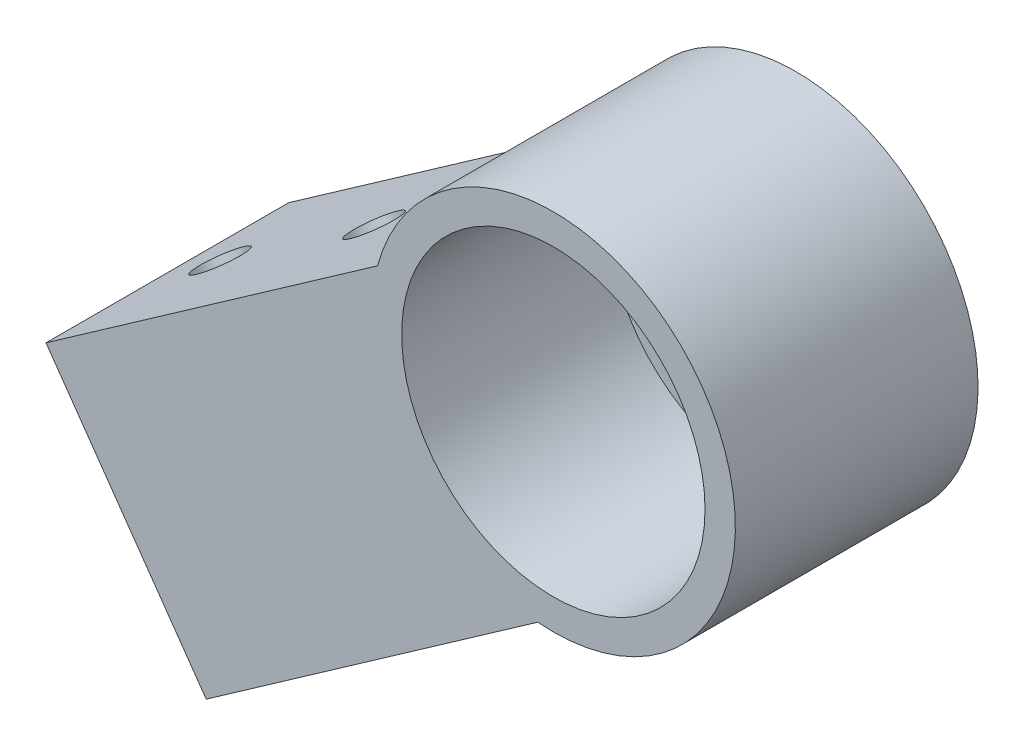
ISO-10303-21;
HEADER;
FILE_DESCRIPTION(('STEP AP214'),'2;1');
FILE_NAME('part.step','',(''),(''),'','','');
FILE_SCHEMA(('AUTOMOTIVE_DESIGN { 1 0 10303 214 1 1 1 1 }'));
ENDSEC;
DATA;
#1=APPLICATION_CONTEXT('core data for automotive mechanical design processes');
#2=APPLICATION_PROTOCOL_DEFINITION('international standard','automotive_design',2000,#1);
#3=PRODUCT_CONTEXT('',#1,'mechanical');
#4=PRODUCT('Part','Part','',(#3));
#5=PRODUCT_RELATED_PRODUCT_CATEGORY('part','',(#4));
#6=PRODUCT_DEFINITION_FORMATION('','',#4);
#7=PRODUCT_DEFINITION_CONTEXT('part definition',#1,'design');
#8=PRODUCT_DEFINITION('design','',#6,#7);
#9=PRODUCT_DEFINITION_SHAPE('','',#8);
#10=(LENGTH_UNIT() NAMED_UNIT(*) SI_UNIT(.MILLI.,.METRE.));
#11=(NAMED_UNIT(*) PLANE_ANGLE_UNIT() SI_UNIT($,.RADIAN.));
#12=(NAMED_UNIT(*) SI_UNIT($,.STERADIAN.) SOLID_ANGLE_UNIT());
#13=UNCERTAINTY_MEASURE_WITH_UNIT(LENGTH_MEASURE(1.E-05),#10,'distance_accuracy_value','');
#14=(GEOMETRIC_REPRESENTATION_CONTEXT(3) GLOBAL_UNCERTAINTY_ASSIGNED_CONTEXT((#13)) GLOBAL_UNIT_ASSIGNED_CONTEXT((#10,
#11,#12)) REPRESENTATION_CONTEXT('',''));
#15=CARTESIAN_POINT('',(0.,0.,0.));
#16=DIRECTION('',(0.,0.,1.));
#17=DIRECTION('',(1.,0.,0.));
#18=AXIS2_PLACEMENT_3D('',#15,#16,#17);
#19=CARTESIAN_POINT('',(0.,0.,3.));
#20=DIRECTION('',(0.,0.,-1.));
#21=DIRECTION('',(-1.,0.,0.));
#22=AXIS2_PLACEMENT_3D('',#19,#20,#21);
#23=CYLINDRICAL_SURFACE('',#22,15.);
#24=CARTESIAN_POINT('',(0.,0.,20.));
#25=DIRECTION('',(0.,0.,1.));
#26=DIRECTION('',(1.,0.,0.));
#27=AXIS2_PLACEMENT_3D('',#24,#25,#26);
#28=CIRCLE('',#27,15.);
#29=CARTESIAN_POINT('',(-1.28498679073982,-14.9448589470635,20.));
#30=VERTEX_POINT('',#29);
#31=CARTESIAN_POINT('',(-14.4871716284404,3.88868335148424,20.));
#32=VERTEX_POINT('',#31);
#33=EDGE_CURVE('E221',#30,#32,#28,.T.);
#34=ORIENTED_EDGE('',*,*,#33,.F.);
#35=DIRECTION('',(0.,0.,-1.));
#36=VECTOR('',#35,1.);
#37=CARTESIAN_POINT('',(-1.28498679073983,-14.9448589470635,75.5471115656489));
#38=LINE('',#37,#36);
#39=CARTESIAN_POINT('',(-1.28498679073983,-14.9448589470635,0.));
#40=VERTEX_POINT('',#39);
#41=EDGE_CURVE('E64',#30,#40,#38,.T.);
#42=ORIENTED_EDGE('',*,*,#41,.T.);
#43=CARTESIAN_POINT('',(0.,0.,0.));
#44=DIRECTION('',(0.,0.,1.));
#45=DIRECTION('',(1.,0.,0.));
#46=AXIS2_PLACEMENT_3D('',#43,#44,#45);
#47=CIRCLE('',#46,15.);
#48=CARTESIAN_POINT('',(-14.4871716284404,3.88868335148424,0.));
#49=VERTEX_POINT('',#48);
#50=EDGE_CURVE('E48',#40,#49,#47,.T.);
#51=ORIENTED_EDGE('',*,*,#50,.T.);
#52=DIRECTION('',(0.,0.,-1.));
#53=VECTOR('',#52,1.);
#54=CARTESIAN_POINT('',(-14.4871716284404,3.88868335148424,75.5471115656489));
#55=LINE('',#54,#53);
#56=EDGE_CURVE('E179',#32,#49,#55,.T.);
#57=ORIENTED_EDGE('',*,*,#56,.F.);
#58=EDGE_LOOP('',(#34,#42,#51,#57));
#59=FACE_BOUND('',#58,.T.);
#60=ADVANCED_FACE('F39',(#59),#23,.T.);
#61=CARTESIAN_POINT('',(0.,0.,0.));
#62=DIRECTION('',(0.,0.,1.));
#63=DIRECTION('',(1.,0.,0.));
#64=AXIS2_PLACEMENT_3D('',#61,#62,#63);
#65=PLANE('',#64);
#66=CARTESIAN_POINT('',(6.96022215381102,4.87906830958517,0.));
#67=DIRECTION('',(0.,0.,1.));
#68=DIRECTION('',(1.,0.,0.));
#69=AXIS2_PLACEMENT_3D('',#66,#67,#68);
#70=CIRCLE('',#69,1.5);
#71=CARTESIAN_POINT('',(8.46022215381102,4.87906830958517,0.));
#72=VERTEX_POINT('',#71);
#73=EDGE_CURVE('E199',#72,#72,#70,.F.);
#74=ORIENTED_EDGE('',*,*,#73,.F.);
#75=EDGE_LOOP('',(#74));
#76=FACE_BOUND('',#75,.T.);
#77=CARTESIAN_POINT('',(-6.96022215381102,-4.87906830958517,0.));
#78=DIRECTION('',(0.,0.,1.));
#79=DIRECTION('',(1.,0.,0.));
#80=AXIS2_PLACEMENT_3D('',#77,#78,#79);
#81=CIRCLE('',#80,1.5);
#82=CARTESIAN_POINT('',(-5.46022215381102,-4.87906830958517,0.));
#83=VERTEX_POINT('',#82);
#84=EDGE_CURVE('E198',#83,#83,#81,.F.);
#85=ORIENTED_EDGE('',*,*,#84,.F.);
#86=EDGE_LOOP('',(#85));
#87=FACE_BOUND('',#86,.T.);
#88=CARTESIAN_POINT('',(0.,0.,0.));
#89=DIRECTION('',(0.,0.,1.));
#90=DIRECTION('',(1.,0.,0.));
#91=AXIS2_PLACEMENT_3D('',#88,#89,#90);
#92=CIRCLE('',#91,3.);
#93=CARTESIAN_POINT('',(3.,0.,0.));
#94=VERTEX_POINT('',#93);
#95=EDGE_CURVE('E213',#94,#94,#92,.F.);
#96=ORIENTED_EDGE('',*,*,#95,.F.);
#97=EDGE_LOOP('',(#96));
#98=FACE_BOUND('',#97,.T.);
#99=ORIENTED_EDGE('',*,*,#50,.F.);
#100=DIRECTION('',(-0.81884966515425,-0.574008036421767,0.));
#101=VECTOR('',#100,1.);
#102=CARTESIAN_POINT('',(-28.6094431827825,-34.0991167154098,0.));
#103=LINE('',#102,#101);
#104=CARTESIAN_POINT('',(-28.6094431827825,-34.0991167154098,0.));
#105=VERTEX_POINT('',#104);
#106=EDGE_CURVE('E155',#40,#105,#103,.T.);
#107=ORIENTED_EDGE('',*,*,#106,.T.);
#108=DIRECTION('',(-0.574008036421766,0.81884966515425,0.));
#109=VECTOR('',#108,1.);
#110=CARTESIAN_POINT('',(-41.8116280204831,-15.2655744168621,0.));
#111=LINE('',#110,#109);
#112=CARTESIAN_POINT('',(-41.8116280204831,-15.2655744168621,0.));
#113=VERTEX_POINT('',#112);
#114=EDGE_CURVE('E166',#105,#113,#111,.T.);
#115=ORIENTED_EDGE('',*,*,#114,.T.);
#116=DIRECTION('',(0.81884966515425,0.574008036421766,0.));
#117=VECTOR('',#116,1.);
#118=CARTESIAN_POINT('',(-14.4871716284404,3.88868335148424,0.));
#119=LINE('',#118,#117);
#120=EDGE_CURVE('E161',#113,#49,#119,.T.);
#121=ORIENTED_EDGE('',*,*,#120,.T.);
#122=EDGE_LOOP('',(#99,#107,#115,#121));
#123=FACE_BOUND('',#122,.T.);
#124=ADVANCED_FACE('F279',(#76,#87,#98,#123),#65,.F.);
#125=CARTESIAN_POINT('',(0.,0.,20.));
#126=DIRECTION('',(0.,0.,1.));
#127=DIRECTION('',(1.,0.,0.));
#128=AXIS2_PLACEMENT_3D('',#125,#126,#127);
#129=PLANE('',#128);
#130=ORIENTED_EDGE('',*,*,#33,.T.);
#131=DIRECTION('',(0.818849665154251,0.574008036421766,0.));
#132=VECTOR('',#131,1.);
#133=CARTESIAN_POINT('',(-14.4871716284404,3.88868335148424,20.));
#134=LINE('',#133,#132);
#135=CARTESIAN_POINT('',(-41.8116280204831,-15.2655744168621,20.));
#136=VERTEX_POINT('',#135);
#137=EDGE_CURVE('E176',#136,#32,#134,.T.);
#138=ORIENTED_EDGE('',*,*,#137,.F.);
#139=DIRECTION('',(-0.574008036421766,0.818849665154251,0.));
#140=VECTOR('',#139,1.);
#141=CARTESIAN_POINT('',(-41.8116280204831,-15.2655744168621,20.));
#142=LINE('',#141,#140);
#143=CARTESIAN_POINT('',(-28.6094431827825,-34.0991167154098,20.));
#144=VERTEX_POINT('',#143);
#145=EDGE_CURVE('E181',#144,#136,#142,.T.);
#146=ORIENTED_EDGE('',*,*,#145,.F.);
#147=DIRECTION('',(-0.81884966515425,-0.574008036421767,0.));
#148=VECTOR('',#147,1.);
#149=CARTESIAN_POINT('',(-28.6094431827825,-34.0991167154098,20.));
#150=LINE('',#149,#148);
#151=EDGE_CURVE('E165',#30,#144,#150,.T.);
#152=ORIENTED_EDGE('',*,*,#151,.F.);
#153=EDGE_LOOP('',(#130,#138,#146,#152));
#154=FACE_BOUND('',#153,.T.);
#155=CARTESIAN_POINT('',(0.,0.,20.));
#156=DIRECTION('',(0.,0.,1.));
#157=DIRECTION('',(1.,0.,0.));
#158=AXIS2_PLACEMENT_3D('',#155,#156,#157);
#159=CIRCLE('',#158,12.5);
#160=CARTESIAN_POINT('',(12.5,0.,20.));
#161=VERTEX_POINT('',#160);
#162=EDGE_CURVE('E217',#161,#161,#159,.T.);
#163=ORIENTED_EDGE('',*,*,#162,.F.);
#164=EDGE_LOOP('',(#163));
#165=FACE_BOUND('',#164,.T.);
#166=ADVANCED_FACE('F284',(#154,#165),#129,.T.);
#167=CARTESIAN_POINT('',(0.,0.,20.));
#168=DIRECTION('',(0.,0.,-1.));
#169=DIRECTION('',(-1.,0.,0.));
#170=AXIS2_PLACEMENT_3D('',#167,#168,#169);
#171=CYLINDRICAL_SURFACE('',#170,12.5);
#172=ORIENTED_EDGE('',*,*,#162,.T.);
#173=EDGE_LOOP('',(#172));
#174=FACE_BOUND('',#173,.T.);
#175=CARTESIAN_POINT('',(0.,0.,3.));
#176=DIRECTION('',(0.,0.,1.));
#177=DIRECTION('',(1.,0.,0.));
#178=AXIS2_PLACEMENT_3D('',#175,#176,#177);
#179=CIRCLE('',#178,12.5);
#180=CARTESIAN_POINT('',(12.5,0.,3.));
#181=VERTEX_POINT('',#180);
#182=EDGE_CURVE('E11',#181,#181,#179,.F.);
#183=ORIENTED_EDGE('',*,*,#182,.T.);
#184=EDGE_LOOP('',(#183));
#185=FACE_BOUND('',#184,.T.);
#186=ADVANCED_FACE('F332',(#174,#185),#171,.F.);
#187=CARTESIAN_POINT('',(0.,0.,3.));
#188=DIRECTION('',(0.,0.,1.));
#189=DIRECTION('',(1.,0.,0.));
#190=AXIS2_PLACEMENT_3D('',#187,#188,#189);
#191=PLANE('',#190);
#192=CARTESIAN_POINT('',(0.,0.,3.));
#193=DIRECTION('',(0.,0.,1.));
#194=DIRECTION('',(1.,0.,0.));
#195=AXIS2_PLACEMENT_3D('',#192,#193,#194);
#196=CIRCLE('',#195,3.);
#197=CARTESIAN_POINT('',(3.,0.,3.));
#198=VERTEX_POINT('',#197);
#199=EDGE_CURVE('E203',#198,#198,#196,.T.);
#200=ORIENTED_EDGE('',*,*,#199,.F.);
#201=EDGE_LOOP('',(#200));
#202=FACE_BOUND('',#201,.T.);
#203=CARTESIAN_POINT('',(6.96022215381102,4.87906830958517,3.));
#204=DIRECTION('',(0.,0.,1.));
#205=DIRECTION('',(1.,0.,0.));
#206=AXIS2_PLACEMENT_3D('',#203,#204,#205);
#207=CIRCLE('',#206,1.5);
#208=CARTESIAN_POINT('',(8.46022215381102,4.87906830958517,3.));
#209=VERTEX_POINT('',#208);
#210=EDGE_CURVE('E193',#209,#209,#207,.T.);
#211=ORIENTED_EDGE('',*,*,#210,.F.);
#212=EDGE_LOOP('',(#211));
#213=FACE_BOUND('',#212,.T.);
#214=CARTESIAN_POINT('',(-6.96022215381102,-4.87906830958517,3.));
#215=DIRECTION('',(0.,0.,1.));
#216=DIRECTION('',(1.,0.,0.));
#217=AXIS2_PLACEMENT_3D('',#214,#215,#216);
#218=CIRCLE('',#217,1.5);
#219=CARTESIAN_POINT('',(-5.46022215381102,-4.87906830958517,3.));
#220=VERTEX_POINT('',#219);
#221=EDGE_CURVE('E194',#220,#220,#218,.T.);
#222=ORIENTED_EDGE('',*,*,#221,.F.);
#223=EDGE_LOOP('',(#222));
#224=FACE_BOUND('',#223,.T.);
#225=ORIENTED_EDGE('',*,*,#182,.F.);
#226=EDGE_LOOP('',(#225));
#227=FACE_BOUND('',#226,.T.);
#228=ADVANCED_FACE('F324',(#202,#213,#224,#227),#191,.T.);
#229=CARTESIAN_POINT('',(-6.96022215381102,-4.87906830958517,-8.48528137423857));
#230=DIRECTION('',(0.,0.,1.));
#231=DIRECTION('',(1.,0.,0.));
#232=AXIS2_PLACEMENT_3D('',#229,#230,#231);
#233=CYLINDRICAL_SURFACE('',#232,1.5);
#234=ORIENTED_EDGE('',*,*,#84,.T.);
#235=EDGE_LOOP('',(#234));
#236=FACE_BOUND('',#235,.T.);
#237=ORIENTED_EDGE('',*,*,#221,.T.);
#238=EDGE_LOOP('',(#237));
#239=FACE_BOUND('',#238,.T.);
#240=ADVANCED_FACE('F320',(#236,#239),#233,.F.);
#241=CARTESIAN_POINT('',(6.96022215381102,4.87906830958517,-8.48528137423857));
#242=DIRECTION('',(0.,0.,1.));
#243=DIRECTION('',(1.,0.,0.));
#244=AXIS2_PLACEMENT_3D('',#241,#242,#243);
#245=CYLINDRICAL_SURFACE('',#244,1.5);
#246=ORIENTED_EDGE('',*,*,#73,.T.);
#247=EDGE_LOOP('',(#246));
#248=FACE_BOUND('',#247,.T.);
#249=ORIENTED_EDGE('',*,*,#210,.T.);
#250=EDGE_LOOP('',(#249));
#251=FACE_BOUND('',#250,.T.);
#252=ADVANCED_FACE('F323',(#248,#251),#245,.F.);
#253=CARTESIAN_POINT('',(0.,0.,-8.48528137423857));
#254=DIRECTION('',(0.,0.,1.));
#255=DIRECTION('',(1.,0.,0.));
#256=AXIS2_PLACEMENT_3D('',#253,#254,#255);
#257=CYLINDRICAL_SURFACE('',#256,3.);
#258=ORIENTED_EDGE('',*,*,#95,.T.);
#259=EDGE_LOOP('',(#258));
#260=FACE_BOUND('',#259,.T.);
#261=ORIENTED_EDGE('',*,*,#199,.T.);
#262=EDGE_LOOP('',(#261));
#263=FACE_BOUND('',#262,.T.);
#264=ADVANCED_FACE('F318',(#260,#263),#257,.F.);
#265=CARTESIAN_POINT('',(-28.6094431827825,-34.0991167154098,75.5471115656489));
#266=DIRECTION('',(0.574008036421767,-0.81884966515425,0.));
#267=DIRECTION('',(0.81884966515425,0.574008036421767,0.));
#268=AXIS2_PLACEMENT_3D('',#265,#266,#267);
#269=PLANE('',#268);
#270=CARTESIAN_POINT('',(-11.5773701475741,-22.1597495578372,10.));
#271=DIRECTION('',(0.574008036421767,-0.81884966515425,0.));
#272=DIRECTION('',(0.81884966515425,0.574008036421767,0.));
#273=AXIS2_PLACEMENT_3D('',#270,#271,#272);
#274=CIRCLE('',#273,2.);
#275=CARTESIAN_POINT('',(-9.93967081726564,-21.0117334849936,10.));
#276=VERTEX_POINT('',#275);
#277=EDGE_CURVE('E240',#276,#276,#274,.T.);
#278=ORIENTED_EDGE('',*,*,#277,.F.);
#279=EDGE_LOOP('',(#278));
#280=FACE_BOUND('',#279,.T.);
#281=CARTESIAN_POINT('',(-24.269539957465,-31.0568741223745,10.));
#282=DIRECTION('',(0.574008036421767,-0.81884966515425,0.));
#283=DIRECTION('',(0.81884966515425,0.574008036421767,0.));
#284=AXIS2_PLACEMENT_3D('',#281,#282,#283);
#285=CIRCLE('',#284,2.);
#286=CARTESIAN_POINT('',(-22.6318406271565,-29.908858049531,10.));
#287=VERTEX_POINT('',#286);
#288=EDGE_CURVE('E231',#287,#287,#285,.T.);
#289=ORIENTED_EDGE('',*,*,#288,.F.);
#290=EDGE_LOOP('',(#289));
#291=FACE_BOUND('',#290,.T.);
#292=ORIENTED_EDGE('',*,*,#41,.F.);
#293=ORIENTED_EDGE('',*,*,#151,.T.);
#294=DIRECTION('',(0.,0.,-1.));
#295=VECTOR('',#294,1.);
#296=CARTESIAN_POINT('',(-28.6094431827825,-34.0991167154098,75.5471115656489));
#297=LINE('',#296,#295);
#298=EDGE_CURVE('E175',#144,#105,#297,.T.);
#299=ORIENTED_EDGE('',*,*,#298,.T.);
#300=ORIENTED_EDGE('',*,*,#106,.F.);
#301=EDGE_LOOP('',(#292,#293,#299,#300));
#302=FACE_BOUND('',#301,.T.);
#303=ADVANCED_FACE('F293',(#280,#291,#302),#269,.T.);
#304=CARTESIAN_POINT('',(-41.8116280204831,-15.2655744168621,75.5471115656489));
#305=DIRECTION('',(-0.818849665154251,-0.574008036421766,0.));
#306=DIRECTION('',(0.574008036421766,-0.818849665154251,0.));
#307=AXIS2_PLACEMENT_3D('',#304,#305,#306);
#308=PLANE('',#307);
#309=DIRECTION('',(0.,0.,-1.));
#310=VECTOR('',#309,1.);
#311=CARTESIAN_POINT('',(-38.9415878383743,-19.3598227426333,3.5));
#312=LINE('',#311,#310);
#313=CARTESIAN_POINT('',(-38.9415878383743,-19.3598227426333,16.5));
#314=VERTEX_POINT('',#313);
#315=CARTESIAN_POINT('',(-38.9415878383743,-19.3598227426333,3.5));
#316=VERTEX_POINT('',#315);
#317=EDGE_CURVE('E56',#314,#316,#312,.T.);
#318=ORIENTED_EDGE('',*,*,#317,.F.);
#319=DIRECTION('',(-0.574008036421767,0.81884966515425,0.));
#320=VECTOR('',#319,1.);
#321=CARTESIAN_POINT('',(-31.4794833648913,-30.0048683896386,16.5));
#322=LINE('',#321,#320);
#323=CARTESIAN_POINT('',(-31.4794833648913,-30.0048683896386,16.5));
#324=VERTEX_POINT('',#323);
#325=EDGE_CURVE('E130',#324,#314,#322,.T.);
#326=ORIENTED_EDGE('',*,*,#325,.F.);
#327=DIRECTION('',(0.,0.,1.));
#328=VECTOR('',#327,1.);
#329=CARTESIAN_POINT('',(-31.4794833648913,-30.0048683896386,3.5));
#330=LINE('',#329,#328);
#331=CARTESIAN_POINT('',(-31.4794833648913,-30.0048683896386,3.5));
#332=VERTEX_POINT('',#331);
#333=EDGE_CURVE('E134',#332,#324,#330,.T.);
#334=ORIENTED_EDGE('',*,*,#333,.F.);
#335=DIRECTION('',(0.574008036421766,-0.818849665154251,0.));
#336=VECTOR('',#335,1.);
#337=CARTESIAN_POINT('',(-31.4794833648913,-30.0048683896386,3.5));
#338=LINE('',#337,#336);
#339=EDGE_CURVE('E146',#316,#332,#338,.T.);
#340=ORIENTED_EDGE('',*,*,#339,.F.);
#341=EDGE_LOOP('',(#318,#326,#334,#340));
#342=FACE_BOUND('',#341,.T.);
#343=ORIENTED_EDGE('',*,*,#298,.F.);
#344=ORIENTED_EDGE('',*,*,#145,.T.);
#345=DIRECTION('',(0.,0.,-1.));
#346=VECTOR('',#345,1.);
#347=CARTESIAN_POINT('',(-41.8116280204831,-15.2655744168621,75.5471115656489));
#348=LINE('',#347,#346);
#349=EDGE_CURVE('E180',#136,#113,#348,.T.);
#350=ORIENTED_EDGE('',*,*,#349,.T.);
#351=ORIENTED_EDGE('',*,*,#114,.F.);
#352=EDGE_LOOP('',(#343,#344,#350,#351));
#353=FACE_BOUND('',#352,.T.);
#354=ADVANCED_FACE('F296',(#342,#353),#308,.T.);
#355=CARTESIAN_POINT('',(-14.4871716284404,3.88868335148424,75.5471115656489));
#356=DIRECTION('',(-0.574008036421766,0.818849665154251,0.));
#357=DIRECTION('',(-0.818849665154251,-0.574008036421766,0.));
#358=AXIS2_PLACEMENT_3D('',#355,#356,#357);
#359=PLANE('',#358);
#360=CARTESIAN_POINT('',(-24.7795549852748,-3.32620725928941,10.));
#361=DIRECTION('',(-0.574008036421766,0.818849665154251,0.));
#362=DIRECTION('',(-0.818849665154251,-0.574008036421766,0.));
#363=AXIS2_PLACEMENT_3D('',#360,#361,#362);
#364=CIRCLE('',#363,2.);
#365=CARTESIAN_POINT('',(-26.4172543155833,-4.47422333213294,10.));
#366=VERTEX_POINT('',#365);
#367=EDGE_CURVE('E137',#366,#366,#364,.T.);
#368=ORIENTED_EDGE('',*,*,#367,.F.);
#369=EDGE_LOOP('',(#368));
#370=FACE_BOUND('',#369,.T.);
#371=CARTESIAN_POINT('',(-37.4717247951657,-12.2233318238268,10.));
#372=DIRECTION('',(-0.574008036421766,0.818849665154251,0.));
#373=DIRECTION('',(-0.818849665154251,-0.574008036421766,0.));
#374=AXIS2_PLACEMENT_3D('',#371,#372,#373);
#375=CIRCLE('',#374,2.);
#376=CARTESIAN_POINT('',(-39.1094241254742,-13.3713478966703,10.));
#377=VERTEX_POINT('',#376);
#378=EDGE_CURVE('E237',#377,#377,#375,.T.);
#379=ORIENTED_EDGE('',*,*,#378,.F.);
#380=EDGE_LOOP('',(#379));
#381=FACE_BOUND('',#380,.T.);
#382=ORIENTED_EDGE('',*,*,#349,.F.);
#383=ORIENTED_EDGE('',*,*,#137,.T.);
#384=ORIENTED_EDGE('',*,*,#56,.T.);
#385=ORIENTED_EDGE('',*,*,#120,.F.);
#386=EDGE_LOOP('',(#382,#383,#384,#385));
#387=FACE_BOUND('',#386,.T.);
#388=ADVANCED_FACE('F300',(#370,#381,#387),#359,.T.);
#389=CARTESIAN_POINT('',(-17.6514965443637,-4.43561379566742,3.5));
#390=DIRECTION('',(-0.574008036421766,0.81884966515425,0.));
#391=DIRECTION('',(-0.81884966515425,-0.574008036421766,0.));
#392=AXIS2_PLACEMENT_3D('',#389,#390,#391);
#393=PLANE('',#392);
#394=CARTESIAN_POINT('',(-21.9095148031659,-7.42045558506067,10.));
#395=DIRECTION('',(-0.574008036421766,0.81884966515425,0.));
#396=DIRECTION('',(-0.81884966515425,-0.574008036421766,0.));
#397=AXIS2_PLACEMENT_3D('',#394,#395,#396);
#398=CIRCLE('',#397,2.);
#399=CARTESIAN_POINT('',(-23.5472141334744,-8.5684716579042,10.));
#400=VERTEX_POINT('',#399);
#401=EDGE_CURVE('E250',#400,#400,#398,.T.);
#402=ORIENTED_EDGE('',*,*,#401,.T.);
#403=EDGE_LOOP('',(#402));
#404=FACE_BOUND('',#403,.T.);
#405=CARTESIAN_POINT('',(-34.6016846130568,-16.317580149598,10.));
#406=DIRECTION('',(-0.574008036421766,0.81884966515425,0.));
#407=DIRECTION('',(-0.81884966515425,-0.574008036421766,0.));
#408=AXIS2_PLACEMENT_3D('',#405,#406,#407);
#409=CIRCLE('',#408,2.);
#410=CARTESIAN_POINT('',(-36.2393839433653,-17.4655962224416,10.));
#411=VERTEX_POINT('',#410);
#412=EDGE_CURVE('E230',#411,#411,#409,.T.);
#413=ORIENTED_EDGE('',*,*,#412,.T.);
#414=EDGE_LOOP('',(#413));
#415=FACE_BOUND('',#414,.T.);
#416=ORIENTED_EDGE('',*,*,#317,.T.);
#417=DIRECTION('',(-0.81884966515425,-0.574008036421766,0.));
#418=VECTOR('',#417,1.);
#419=CARTESIAN_POINT('',(-17.6514965443637,-4.43561379566742,3.5));
#420=LINE('',#419,#418);
#421=CARTESIAN_POINT('',(-17.6514965443637,-4.43561379566742,3.5));
#422=VERTEX_POINT('',#421);
#423=EDGE_CURVE('E105',#422,#316,#420,.T.);
#424=ORIENTED_EDGE('',*,*,#423,.F.);
#425=DIRECTION('',(0.,0.,-1.));
#426=VECTOR('',#425,1.);
#427=CARTESIAN_POINT('',(-17.6514965443637,-4.43561379566742,3.5));
#428=LINE('',#427,#426);
#429=CARTESIAN_POINT('',(-17.6514965443638,-4.43561379566742,16.5));
#430=VERTEX_POINT('',#429);
#431=EDGE_CURVE('E109',#430,#422,#428,.T.);
#432=ORIENTED_EDGE('',*,*,#431,.F.);
#433=DIRECTION('',(-0.81884966515425,-0.574008036421766,0.));
#434=VECTOR('',#433,1.);
#435=CARTESIAN_POINT('',(-17.6514965443638,-4.43561379566742,16.5));
#436=LINE('',#435,#434);
#437=EDGE_CURVE('E152',#430,#314,#436,.T.);
#438=ORIENTED_EDGE('',*,*,#437,.T.);
#439=EDGE_LOOP('',(#416,#424,#432,#438));
#440=FACE_BOUND('',#439,.T.);
#441=ADVANCED_FACE('F107',(#404,#415,#440),#393,.F.);
#442=CARTESIAN_POINT('',(-10.1893920708808,-15.0806594426727,16.5));
#443=DIRECTION('',(0.,0.,1.));
#444=DIRECTION('',(1.,0.,0.));
#445=AXIS2_PLACEMENT_3D('',#442,#443,#444);
#446=PLANE('',#445);
#447=ORIENTED_EDGE('',*,*,#325,.T.);
#448=ORIENTED_EDGE('',*,*,#437,.F.);
#449=DIRECTION('',(-0.574008036421767,0.81884966515425,0.));
#450=VECTOR('',#449,1.);
#451=CARTESIAN_POINT('',(-10.1893920708808,-15.0806594426727,16.5));
#452=LINE('',#451,#450);
#453=CARTESIAN_POINT('',(-10.1893920708808,-15.0806594426727,16.5));
#454=VERTEX_POINT('',#453);
#455=EDGE_CURVE('E116',#454,#430,#452,.T.);
#456=ORIENTED_EDGE('',*,*,#455,.F.);
#457=DIRECTION('',(-0.81884966515425,-0.574008036421766,0.));
#458=VECTOR('',#457,1.);
#459=CARTESIAN_POINT('',(-10.1893920708808,-15.0806594426727,16.5));
#460=LINE('',#459,#458);
#461=EDGE_CURVE('E156',#454,#324,#460,.T.);
#462=ORIENTED_EDGE('',*,*,#461,.T.);
#463=EDGE_LOOP('',(#447,#448,#456,#462));
#464=FACE_BOUND('',#463,.T.);
#465=ADVANCED_FACE('F308',(#464),#446,.F.);
#466=CARTESIAN_POINT('',(-10.1893920708808,-15.0806594426727,3.5));
#467=DIRECTION('',(0.574008036421766,-0.81884966515425,0.));
#468=DIRECTION('',(0.81884966515425,0.574008036421766,0.));
#469=AXIS2_PLACEMENT_3D('',#466,#467,#468);
#470=PLANE('',#469);
#471=CARTESIAN_POINT('',(-14.447410329683,-18.0655012320659,10.));
#472=DIRECTION('',(0.574008036421766,-0.81884966515425,0.));
#473=DIRECTION('',(0.81884966515425,0.574008036421766,0.));
#474=AXIS2_PLACEMENT_3D('',#471,#472,#473);
#475=CIRCLE('',#474,2.);
#476=CARTESIAN_POINT('',(-12.8097109993745,-16.9174851592224,10.));
#477=VERTEX_POINT('',#476);
#478=EDGE_CURVE('E42',#477,#477,#475,.T.);
#479=ORIENTED_EDGE('',*,*,#478,.T.);
#480=EDGE_LOOP('',(#479));
#481=FACE_BOUND('',#480,.T.);
#482=CARTESIAN_POINT('',(-27.1395801395739,-26.9626257966033,10.));
#483=DIRECTION('',(0.574008036421766,-0.81884966515425,0.));
#484=DIRECTION('',(0.81884966515425,0.574008036421766,0.));
#485=AXIS2_PLACEMENT_3D('',#482,#483,#484);
#486=CIRCLE('',#485,2.);
#487=CARTESIAN_POINT('',(-25.5018808092654,-25.8146097237598,10.));
#488=VERTEX_POINT('',#487);
#489=EDGE_CURVE('E227',#488,#488,#486,.T.);
#490=ORIENTED_EDGE('',*,*,#489,.T.);
#491=EDGE_LOOP('',(#490));
#492=FACE_BOUND('',#491,.T.);
#493=ORIENTED_EDGE('',*,*,#333,.T.);
#494=ORIENTED_EDGE('',*,*,#461,.F.);
#495=DIRECTION('',(0.,0.,1.));
#496=VECTOR('',#495,1.);
#497=CARTESIAN_POINT('',(-10.1893920708808,-15.0806594426727,3.5));
#498=LINE('',#497,#496);
#499=CARTESIAN_POINT('',(-10.1893920708808,-15.0806594426727,3.5));
#500=VERTEX_POINT('',#499);
#501=EDGE_CURVE('E125',#500,#454,#498,.T.);
#502=ORIENTED_EDGE('',*,*,#501,.F.);
#503=DIRECTION('',(-0.81884966515425,-0.574008036421766,0.));
#504=VECTOR('',#503,1.);
#505=CARTESIAN_POINT('',(-10.1893920708808,-15.0806594426727,3.5));
#506=LINE('',#505,#504);
#507=EDGE_CURVE('E115',#500,#332,#506,.T.);
#508=ORIENTED_EDGE('',*,*,#507,.T.);
#509=EDGE_LOOP('',(#493,#494,#502,#508));
#510=FACE_BOUND('',#509,.T.);
#511=ADVANCED_FACE('F261',(#481,#492,#510),#470,.F.);
#512=CARTESIAN_POINT('',(-10.1893920708808,-15.0806594426727,3.5));
#513=DIRECTION('',(0.,0.,-1.));
#514=DIRECTION('',(-1.,0.,0.));
#515=AXIS2_PLACEMENT_3D('',#512,#513,#514);
#516=PLANE('',#515);
#517=ORIENTED_EDGE('',*,*,#339,.T.);
#518=ORIENTED_EDGE('',*,*,#507,.F.);
#519=DIRECTION('',(0.574008036421766,-0.818849665154251,0.));
#520=VECTOR('',#519,1.);
#521=CARTESIAN_POINT('',(-10.1893920708808,-15.0806594426727,3.5));
#522=LINE('',#521,#520);
#523=EDGE_CURVE('E119',#422,#500,#522,.T.);
#524=ORIENTED_EDGE('',*,*,#523,.F.);
#525=ORIENTED_EDGE('',*,*,#423,.T.);
#526=EDGE_LOOP('',(#517,#518,#524,#525));
#527=FACE_BOUND('',#526,.T.);
#528=ADVANCED_FACE('F120',(#527),#516,.F.);
#529=CARTESIAN_POINT('',(-13.9204443076223,-9.75813661917005,0.));
#530=DIRECTION('',(-0.81884966515425,-0.574008036421767,0.));
#531=DIRECTION('',(0.574008036421767,-0.81884966515425,0.));
#532=AXIS2_PLACEMENT_3D('',#529,#530,#531);
#533=PLANE('',#532);
#534=ORIENTED_EDGE('',*,*,#431,.T.);
#535=ORIENTED_EDGE('',*,*,#523,.T.);
#536=ORIENTED_EDGE('',*,*,#501,.T.);
#537=ORIENTED_EDGE('',*,*,#455,.T.);
#538=EDGE_LOOP('',(#534,#535,#536,#537));
#539=FACE_BOUND('',#538,.T.);
#540=ADVANCED_FACE('F127',(#539),#533,.T.);
#541=CARTESIAN_POINT('',(-51.697340405217,8.07018297000525,10.));
#542=DIRECTION('',(0.574008036421767,-0.81884966515425,0.));
#543=DIRECTION('',(0.81884966515425,0.574008036421767,0.));
#544=AXIS2_PLACEMENT_3D('',#541,#542,#543);
#545=CYLINDRICAL_SURFACE('',#544,2.);
#546=ORIENTED_EDGE('',*,*,#288,.T.);
#547=EDGE_LOOP('',(#546));
#548=FACE_BOUND('',#547,.T.);
#549=ORIENTED_EDGE('',*,*,#489,.F.);
#550=EDGE_LOOP('',(#549));
#551=FACE_BOUND('',#550,.T.);
#552=ADVANCED_FACE('F266',(#548,#551),#545,.F.);
#553=CARTESIAN_POINT('',(-39.0051705953261,16.9673075345426,10.));
#554=DIRECTION('',(0.574008036421767,-0.81884966515425,0.));
#555=DIRECTION('',(0.81884966515425,0.574008036421767,0.));
#556=AXIS2_PLACEMENT_3D('',#553,#554,#555);
#557=CYLINDRICAL_SURFACE('',#556,2.);
#558=ORIENTED_EDGE('',*,*,#277,.T.);
#559=EDGE_LOOP('',(#558));
#560=FACE_BOUND('',#559,.T.);
#561=ORIENTED_EDGE('',*,*,#478,.F.);
#562=EDGE_LOOP('',(#561));
#563=FACE_BOUND('',#562,.T.);
#564=ADVANCED_FACE('F263',(#560,#563),#557,.F.);
#565=ORIENTED_EDGE('',*,*,#378,.T.);
#566=EDGE_LOOP('',(#565));
#567=FACE_BOUND('',#566,.T.);
#568=ORIENTED_EDGE('',*,*,#412,.F.);
#569=EDGE_LOOP('',(#568));
#570=FACE_BOUND('',#569,.T.);
#571=ADVANCED_FACE('F265',(#567,#570),#545,.F.);
#572=ORIENTED_EDGE('',*,*,#367,.T.);
#573=EDGE_LOOP('',(#572));
#574=FACE_BOUND('',#573,.T.);
#575=ORIENTED_EDGE('',*,*,#401,.F.);
#576=EDGE_LOOP('',(#575));
#577=FACE_BOUND('',#576,.T.);
#578=ADVANCED_FACE('F269',(#574,#577),#557,.F.);
#579=CLOSED_SHELL('',(#60,#124,#166,#186,#228,#240,#252,#264,#303,#354,#388,#441,#465,#511,#528,
#540,#552,#564,#571,#578));
#580=MANIFOLD_SOLID_BREP('B2',#579);
#581=ADVANCED_BREP_SHAPE_REPRESENTATION('',(#18,#580),#14);
#582=SHAPE_DEFINITION_REPRESENTATION(#9,#581);
ENDSEC;
END-ISO-10303-21;
